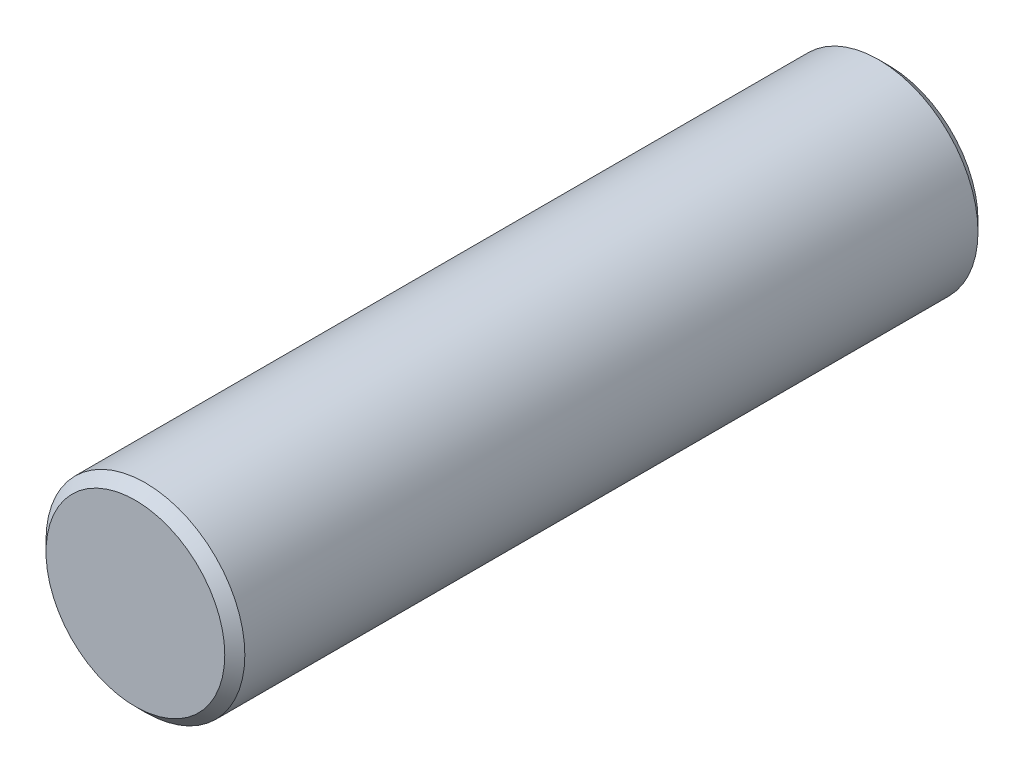
ISO-10303-21;
HEADER;
FILE_DESCRIPTION(('STEP AP214'),'2;1');
FILE_NAME('part.step','',(''),(''),'','','');
FILE_SCHEMA(('AUTOMOTIVE_DESIGN { 1 0 10303 214 1 1 1 1 }'));
ENDSEC;
DATA;
#1=APPLICATION_CONTEXT('core data for automotive mechanical design processes');
#2=APPLICATION_PROTOCOL_DEFINITION('international standard','automotive_design',2000,#1);
#3=PRODUCT_CONTEXT('',#1,'mechanical');
#4=PRODUCT('Part','Part','',(#3));
#5=PRODUCT_RELATED_PRODUCT_CATEGORY('part','',(#4));
#6=PRODUCT_DEFINITION_FORMATION('','',#4);
#7=PRODUCT_DEFINITION_CONTEXT('part definition',#1,'design');
#8=PRODUCT_DEFINITION('design','',#6,#7);
#9=PRODUCT_DEFINITION_SHAPE('','',#8);
#10=(LENGTH_UNIT() NAMED_UNIT(*) SI_UNIT(.MILLI.,.METRE.));
#11=(NAMED_UNIT(*) PLANE_ANGLE_UNIT() SI_UNIT($,.RADIAN.));
#12=(NAMED_UNIT(*) SI_UNIT($,.STERADIAN.) SOLID_ANGLE_UNIT());
#13=UNCERTAINTY_MEASURE_WITH_UNIT(LENGTH_MEASURE(1.E-05),#10,'distance_accuracy_value','');
#14=(GEOMETRIC_REPRESENTATION_CONTEXT(3) GLOBAL_UNCERTAINTY_ASSIGNED_CONTEXT((#13)) GLOBAL_UNIT_ASSIGNED_CONTEXT((#10,
#11,#12)) REPRESENTATION_CONTEXT('',''));
#15=CARTESIAN_POINT('',(0.,0.,0.));
#16=DIRECTION('',(0.,0.,1.));
#17=DIRECTION('',(1.,0.,0.));
#18=AXIS2_PLACEMENT_3D('',#15,#16,#17);
#19=CARTESIAN_POINT('',(0.,0.,75.));
#20=DIRECTION('',(0.,0.,-1.));
#21=DIRECTION('',(-1.,0.,0.));
#22=AXIS2_PLACEMENT_3D('',#19,#20,#21);
#23=CYLINDRICAL_SURFACE('',#22,9.9);
#24=CARTESIAN_POINT('',(0.,0.,74.));
#25=DIRECTION('',(0.,0.,1.));
#26=DIRECTION('',(1.,0.,0.));
#27=AXIS2_PLACEMENT_3D('',#24,#25,#26);
#28=CIRCLE('',#27,9.9);
#29=CARTESIAN_POINT('',(9.9,0.,74.));
#30=VERTEX_POINT('',#29);
#31=EDGE_CURVE('E10',#30,#30,#28,.F.);
#32=ORIENTED_EDGE('',*,*,#31,.T.);
#33=EDGE_LOOP('',(#32));
#34=FACE_BOUND('',#33,.T.);
#35=CARTESIAN_POINT('',(0.,0.,1.00000000000001));
#36=DIRECTION('',(0.,0.,1.));
#37=DIRECTION('',(1.,0.,0.));
#38=AXIS2_PLACEMENT_3D('',#35,#36,#37);
#39=CIRCLE('',#38,9.9);
#40=CARTESIAN_POINT('',(9.9,0.,1.00000000000001));
#41=VERTEX_POINT('',#40);
#42=EDGE_CURVE('E54',#41,#41,#39,.T.);
#43=ORIENTED_EDGE('',*,*,#42,.T.);
#44=EDGE_LOOP('',(#43));
#45=FACE_BOUND('',#44,.T.);
#46=ADVANCED_FACE('F39',(#34,#45),#23,.T.);
#47=CARTESIAN_POINT('',(0.,0.,75.));
#48=DIRECTION('',(0.,0.,1.));
#49=DIRECTION('',(1.,0.,0.));
#50=AXIS2_PLACEMENT_3D('',#47,#48,#49);
#51=PLANE('',#50);
#52=CARTESIAN_POINT('',(0.,0.,75.));
#53=DIRECTION('',(0.,0.,1.));
#54=DIRECTION('',(1.,0.,0.));
#55=AXIS2_PLACEMENT_3D('',#52,#53,#54);
#56=CIRCLE('',#55,8.89999999999998);
#57=CARTESIAN_POINT('',(8.89999999999998,0.,75.));
#58=VERTEX_POINT('',#57);
#59=EDGE_CURVE('E50',#58,#58,#56,.T.);
#60=ORIENTED_EDGE('',*,*,#59,.T.);
#61=EDGE_LOOP('',(#60));
#62=FACE_BOUND('',#61,.T.);
#63=ADVANCED_FACE('F75',(#62),#51,.T.);
#64=CARTESIAN_POINT('',(0.,0.,0.));
#65=DIRECTION('',(0.,0.,1.));
#66=DIRECTION('',(1.,0.,0.));
#67=AXIS2_PLACEMENT_3D('',#64,#65,#66);
#68=PLANE('',#67);
#69=CARTESIAN_POINT('',(0.,0.,0.));
#70=DIRECTION('',(0.,0.,1.));
#71=DIRECTION('',(1.,0.,0.));
#72=AXIS2_PLACEMENT_3D('',#69,#70,#71);
#73=CIRCLE('',#72,8.89999999999998);
#74=CARTESIAN_POINT('',(8.89999999999998,0.,0.));
#75=VERTEX_POINT('',#74);
#76=EDGE_CURVE('E51',#75,#75,#73,.F.);
#77=ORIENTED_EDGE('',*,*,#76,.T.);
#78=EDGE_LOOP('',(#77));
#79=FACE_BOUND('',#78,.T.);
#80=ADVANCED_FACE('F65',(#79),#68,.F.);
#81=CARTESIAN_POINT('',(0.,0.,1.00000000000001));
#82=DIRECTION('',(0.,0.,1.));
#83=DIRECTION('',(1.,0.,0.));
#84=AXIS2_PLACEMENT_3D('',#81,#82,#83);
#85=CONICAL_SURFACE('',#84,9.9,0.785398163397453);
#86=ORIENTED_EDGE('',*,*,#76,.F.);
#87=EDGE_LOOP('',(#86));
#88=FACE_BOUND('',#87,.T.);
#89=ORIENTED_EDGE('',*,*,#42,.F.);
#90=EDGE_LOOP('',(#89));
#91=FACE_BOUND('',#90,.T.);
#92=ADVANCED_FACE('F64',(#88,#91),#85,.T.);
#93=CARTESIAN_POINT('',(0.,0.,75.));
#94=DIRECTION('',(0.,0.,-1.));
#95=DIRECTION('',(-1.,0.,0.));
#96=AXIS2_PLACEMENT_3D('',#93,#94,#95);
#97=CONICAL_SURFACE('',#96,8.89999999999998,0.785398163397442);
#98=ORIENTED_EDGE('',*,*,#31,.F.);
#99=EDGE_LOOP('',(#98));
#100=FACE_BOUND('',#99,.T.);
#101=ORIENTED_EDGE('',*,*,#59,.F.);
#102=EDGE_LOOP('',(#101));
#103=FACE_BOUND('',#102,.T.);
#104=ADVANCED_FACE('F45',(#100,#103),#97,.T.);
#105=CLOSED_SHELL('',(#46,#63,#80,#92,#104));
#106=MANIFOLD_SOLID_BREP('B2',#105);
#107=ADVANCED_BREP_SHAPE_REPRESENTATION('',(#18,#106),#14);
#108=SHAPE_DEFINITION_REPRESENTATION(#9,#107);
ENDSEC;
END-ISO-10303-21;
